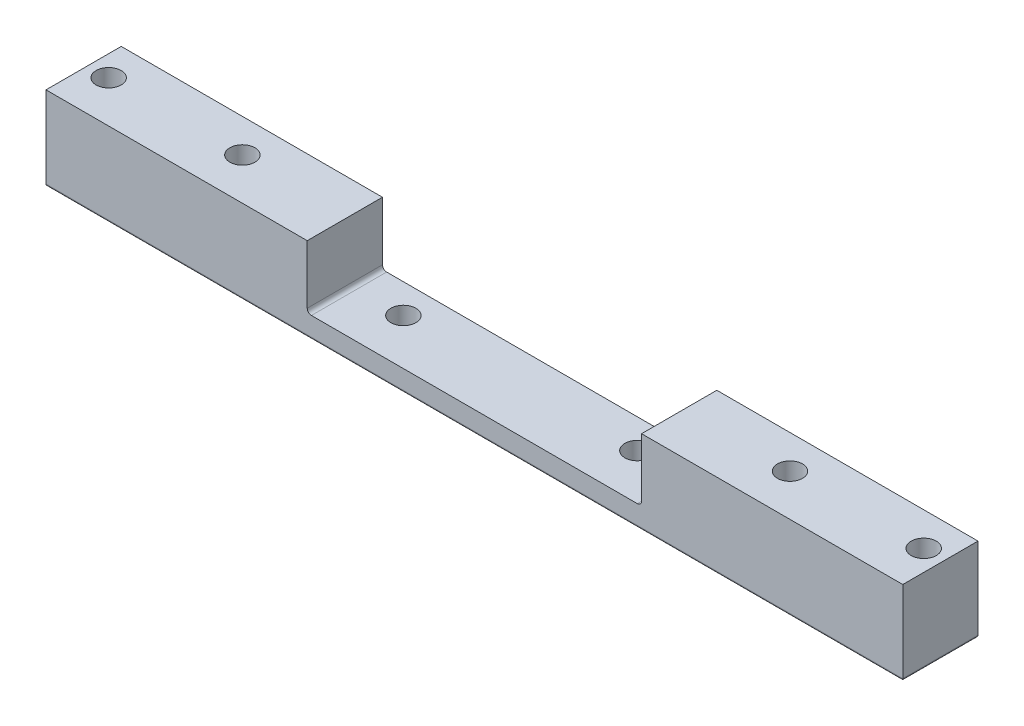
ISO-10303-21;
HEADER;
FILE_DESCRIPTION(('STEP AP214'),'2;1');
FILE_NAME('part.step','',(''),(''),'','','');
FILE_SCHEMA(('AUTOMOTIVE_DESIGN { 1 0 10303 214 1 1 1 1 }'));
ENDSEC;
DATA;
#1=APPLICATION_CONTEXT('core data for automotive mechanical design processes');
#2=APPLICATION_PROTOCOL_DEFINITION('international standard','automotive_design',2000,#1);
#3=PRODUCT_CONTEXT('',#1,'mechanical');
#4=PRODUCT('Part','Part','',(#3));
#5=PRODUCT_RELATED_PRODUCT_CATEGORY('part','',(#4));
#6=PRODUCT_DEFINITION_FORMATION('','',#4);
#7=PRODUCT_DEFINITION_CONTEXT('part definition',#1,'design');
#8=PRODUCT_DEFINITION('design','',#6,#7);
#9=PRODUCT_DEFINITION_SHAPE('','',#8);
#10=(LENGTH_UNIT() NAMED_UNIT(*) SI_UNIT(.MILLI.,.METRE.));
#11=(NAMED_UNIT(*) PLANE_ANGLE_UNIT() SI_UNIT($,.RADIAN.));
#12=(NAMED_UNIT(*) SI_UNIT($,.STERADIAN.) SOLID_ANGLE_UNIT());
#13=UNCERTAINTY_MEASURE_WITH_UNIT(LENGTH_MEASURE(1.E-05),#10,'distance_accuracy_value','');
#14=(GEOMETRIC_REPRESENTATION_CONTEXT(3) GLOBAL_UNCERTAINTY_ASSIGNED_CONTEXT((#13)) GLOBAL_UNIT_ASSIGNED_CONTEXT((#10,
#11,#12)) REPRESENTATION_CONTEXT('',''));
#15=CARTESIAN_POINT('',(0.,0.,0.));
#16=DIRECTION('',(0.,0.,1.));
#17=DIRECTION('',(1.,0.,0.));
#18=AXIS2_PLACEMENT_3D('',#15,#16,#17);
#19=CARTESIAN_POINT('',(62.5033,20.,0.));
#20=DIRECTION('',(1.,0.,0.));
#21=DIRECTION('',(0.,0.,-1.));
#22=AXIS2_PLACEMENT_3D('',#19,#20,#21);
#23=PLANE('',#22);
#24=DIRECTION('',(0.,-1.,0.));
#25=VECTOR('',#24,1.);
#26=CARTESIAN_POINT('',(62.5033,20.,18.));
#27=LINE('',#26,#25);
#28=CARTESIAN_POINT('',(62.5033,20.,18.));
#29=VERTEX_POINT('',#28);
#30=CARTESIAN_POINT('',(62.5033,6.,18.));
#31=VERTEX_POINT('',#30);
#32=EDGE_CURVE('E185',#29,#31,#27,.T.);
#33=ORIENTED_EDGE('',*,*,#32,.T.);
#34=DIRECTION('',(0.,0.,1.));
#35=VECTOR('',#34,1.);
#36=CARTESIAN_POINT('',(62.5033,6.,0.));
#37=LINE('',#36,#35);
#38=CARTESIAN_POINT('',(62.5033,6.,0.));
#39=VERTEX_POINT('',#38);
#40=EDGE_CURVE('E266',#31,#39,#37,.F.);
#41=ORIENTED_EDGE('',*,*,#40,.T.);
#42=DIRECTION('',(0.,-1.,0.));
#43=VECTOR('',#42,1.);
#44=CARTESIAN_POINT('',(62.5033,20.,0.));
#45=LINE('',#44,#43);
#46=CARTESIAN_POINT('',(62.5033,20.,0.));
#47=VERTEX_POINT('',#46);
#48=EDGE_CURVE('E194',#47,#39,#45,.T.);
#49=ORIENTED_EDGE('',*,*,#48,.F.);
#50=DIRECTION('',(0.,0.,1.));
#51=VECTOR('',#50,1.);
#52=CARTESIAN_POINT('',(62.5033,20.,0.));
#53=LINE('',#52,#51);
#54=EDGE_CURVE('E174',#47,#29,#53,.T.);
#55=ORIENTED_EDGE('',*,*,#54,.T.);
#56=EDGE_LOOP('',(#33,#41,#49,#55));
#57=FACE_BOUND('',#56,.T.);
#58=ADVANCED_FACE('F35',(#57),#23,.T.);
#59=CARTESIAN_POINT('',(0.,20.,0.));
#60=DIRECTION('',(0.,0.,-1.));
#61=DIRECTION('',(-1.,0.,0.));
#62=AXIS2_PLACEMENT_3D('',#59,#60,#61);
#63=PLANE('',#62);
#64=DIRECTION('',(0.,-1.,0.));
#65=VECTOR('',#64,1.);
#66=CARTESIAN_POINT('',(205.,20.,0.));
#67=LINE('',#66,#65);
#68=CARTESIAN_POINT('',(205.,20.,0.));
#69=VERTEX_POINT('',#68);
#70=CARTESIAN_POINT('',(205.,0.5,0.));
#71=VERTEX_POINT('',#70);
#72=EDGE_CURVE('E123',#69,#71,#67,.T.);
#73=ORIENTED_EDGE('',*,*,#72,.T.);
#74=DIRECTION('',(1.,0.,0.));
#75=VECTOR('',#74,1.);
#76=CARTESIAN_POINT('',(0.,0.5,0.));
#77=LINE('',#76,#75);
#78=CARTESIAN_POINT('',(0.,0.5,0.));
#79=VERTEX_POINT('',#78);
#80=EDGE_CURVE('E242',#71,#79,#77,.F.);
#81=ORIENTED_EDGE('',*,*,#80,.T.);
#82=DIRECTION('',(0.,-1.,0.));
#83=VECTOR('',#82,1.);
#84=CARTESIAN_POINT('',(0.,20.,0.));
#85=LINE('',#84,#83);
#86=CARTESIAN_POINT('',(0.,20.,0.));
#87=VERTEX_POINT('',#86);
#88=EDGE_CURVE('E191',#87,#79,#85,.T.);
#89=ORIENTED_EDGE('',*,*,#88,.F.);
#90=DIRECTION('',(1.,0.,0.));
#91=VECTOR('',#90,1.);
#92=CARTESIAN_POINT('',(0.,20.,0.));
#93=LINE('',#92,#91);
#94=EDGE_CURVE('E177',#87,#47,#93,.T.);
#95=ORIENTED_EDGE('',*,*,#94,.T.);
#96=ORIENTED_EDGE('',*,*,#48,.T.);
#97=CARTESIAN_POINT('',(63.5033,6.,0.));
#98=DIRECTION('',(0.,0.,-1.));
#99=DIRECTION('',(-1.,0.,0.));
#100=AXIS2_PLACEMENT_3D('',#97,#98,#99);
#101=CIRCLE('',#100,1.);
#102=CARTESIAN_POINT('',(63.5033,5.,0.));
#103=VERTEX_POINT('',#102);
#104=EDGE_CURVE('E272',#39,#103,#101,.F.);
#105=ORIENTED_EDGE('',*,*,#104,.T.);
#106=DIRECTION('',(1.,0.,0.));
#107=VECTOR('',#106,1.);
#108=CARTESIAN_POINT('',(0.,5.,0.));
#109=LINE('',#108,#107);
#110=CARTESIAN_POINT('',(141.5033,5.,0.));
#111=VERTEX_POINT('',#110);
#112=EDGE_CURVE('E163',#103,#111,#109,.T.);
#113=ORIENTED_EDGE('',*,*,#112,.T.);
#114=CARTESIAN_POINT('',(141.5033,6.,0.));
#115=DIRECTION('',(0.,0.,-1.));
#116=DIRECTION('',(-1.,0.,0.));
#117=AXIS2_PLACEMENT_3D('',#114,#115,#116);
#118=CIRCLE('',#117,1.);
#119=CARTESIAN_POINT('',(142.5033,6.,0.));
#120=VERTEX_POINT('',#119);
#121=EDGE_CURVE('E11',#111,#120,#118,.F.);
#122=ORIENTED_EDGE('',*,*,#121,.T.);
#123=DIRECTION('',(0.,-1.,0.));
#124=VECTOR('',#123,1.);
#125=CARTESIAN_POINT('',(142.5033,20.,0.));
#126=LINE('',#125,#124);
#127=CARTESIAN_POINT('',(142.5033,20.,0.));
#128=VERTEX_POINT('',#127);
#129=EDGE_CURVE('E133',#128,#120,#126,.T.);
#130=ORIENTED_EDGE('',*,*,#129,.F.);
#131=DIRECTION('',(1.,0.,0.));
#132=VECTOR('',#131,1.);
#133=CARTESIAN_POINT('',(0.,20.,0.));
#134=LINE('',#133,#132);
#135=EDGE_CURVE('E139',#128,#69,#134,.T.);
#136=ORIENTED_EDGE('',*,*,#135,.T.);
#137=EDGE_LOOP('',(#73,#81,#89,#95,#96,#105,#113,#122,#130,#136));
#138=FACE_BOUND('',#137,.T.);
#139=ADVANCED_FACE('F144',(#138),#63,.T.);
#140=CARTESIAN_POINT('',(0.,20.,0.));
#141=DIRECTION('',(1.,0.,0.));
#142=DIRECTION('',(0.,0.,-1.));
#143=AXIS2_PLACEMENT_3D('',#140,#141,#142);
#144=PLANE('',#143);
#145=ORIENTED_EDGE('',*,*,#88,.T.);
#146=DIRECTION('',(0.,0.,1.));
#147=VECTOR('',#146,1.);
#148=CARTESIAN_POINT('',(0.,0.5,0.));
#149=LINE('',#148,#147);
#150=CARTESIAN_POINT('',(0.,0.5,18.));
#151=VERTEX_POINT('',#150);
#152=EDGE_CURVE('E236',#79,#151,#149,.T.);
#153=ORIENTED_EDGE('',*,*,#152,.T.);
#154=DIRECTION('',(0.,-1.,0.));
#155=VECTOR('',#154,1.);
#156=CARTESIAN_POINT('',(0.,20.,18.));
#157=LINE('',#156,#155);
#158=CARTESIAN_POINT('',(0.,20.,18.));
#159=VERTEX_POINT('',#158);
#160=EDGE_CURVE('E188',#159,#151,#157,.T.);
#161=ORIENTED_EDGE('',*,*,#160,.F.);
#162=DIRECTION('',(0.,0.,1.));
#163=VECTOR('',#162,1.);
#164=CARTESIAN_POINT('',(0.,20.,0.));
#165=LINE('',#164,#163);
#166=EDGE_CURVE('E180',#87,#159,#165,.T.);
#167=ORIENTED_EDGE('',*,*,#166,.F.);
#168=EDGE_LOOP('',(#145,#153,#161,#167));
#169=FACE_BOUND('',#168,.T.);
#170=ADVANCED_FACE('F301',(#169),#144,.F.);
#171=CARTESIAN_POINT('',(4.99,20.,8.));
#172=DIRECTION('',(0.,-1.,0.));
#173=DIRECTION('',(0.,0.,-1.));
#174=AXIS2_PLACEMENT_3D('',#171,#172,#173);
#175=CYLINDRICAL_SURFACE('',#174,3.);
#176=CARTESIAN_POINT('',(4.99,0.5,8.));
#177=DIRECTION('',(0.,1.,0.));
#178=DIRECTION('',(0.,0.,1.));
#179=AXIS2_PLACEMENT_3D('',#176,#177,#178);
#180=CIRCLE('',#179,3.);
#181=CARTESIAN_POINT('',(4.99,0.5,11.));
#182=VERTEX_POINT('',#181);
#183=EDGE_CURVE('E244',#182,#182,#180,.F.);
#184=ORIENTED_EDGE('',*,*,#183,.T.);
#185=EDGE_LOOP('',(#184));
#186=FACE_BOUND('',#185,.T.);
#187=CARTESIAN_POINT('',(4.99,20.,8.));
#188=DIRECTION('',(0.,1.,0.));
#189=DIRECTION('',(0.,0.,1.));
#190=AXIS2_PLACEMENT_3D('',#187,#188,#189);
#191=CIRCLE('',#190,3.);
#192=CARTESIAN_POINT('',(4.99,20.,11.));
#193=VERTEX_POINT('',#192);
#194=EDGE_CURVE('E171',#193,#193,#191,.T.);
#195=ORIENTED_EDGE('',*,*,#194,.T.);
#196=EDGE_LOOP('',(#195));
#197=FACE_BOUND('',#196,.T.);
#198=ADVANCED_FACE('F305',(#186,#197),#175,.F.);
#199=CARTESIAN_POINT('',(36.99,20.,8.));
#200=DIRECTION('',(0.,-1.,0.));
#201=DIRECTION('',(0.,0.,-1.));
#202=AXIS2_PLACEMENT_3D('',#199,#200,#201);
#203=CYLINDRICAL_SURFACE('',#202,3.);
#204=CARTESIAN_POINT('',(36.99,0.5,8.));
#205=DIRECTION('',(0.,1.,0.));
#206=DIRECTION('',(0.,0.,1.));
#207=AXIS2_PLACEMENT_3D('',#204,#205,#206);
#208=CIRCLE('',#207,3.);
#209=CARTESIAN_POINT('',(36.99,0.5,11.));
#210=VERTEX_POINT('',#209);
#211=EDGE_CURVE('E247',#210,#210,#208,.F.);
#212=ORIENTED_EDGE('',*,*,#211,.T.);
#213=EDGE_LOOP('',(#212));
#214=FACE_BOUND('',#213,.T.);
#215=CARTESIAN_POINT('',(36.99,20.,8.));
#216=DIRECTION('',(0.,1.,0.));
#217=DIRECTION('',(0.,0.,1.));
#218=AXIS2_PLACEMENT_3D('',#215,#216,#217);
#219=CIRCLE('',#218,3.);
#220=CARTESIAN_POINT('',(36.99,20.,11.));
#221=VERTEX_POINT('',#220);
#222=EDGE_CURVE('E168',#221,#221,#219,.T.);
#223=ORIENTED_EDGE('',*,*,#222,.T.);
#224=EDGE_LOOP('',(#223));
#225=FACE_BOUND('',#224,.T.);
#226=ADVANCED_FACE('F308',(#214,#225),#203,.F.);
#227=CARTESIAN_POINT('',(0.,20.,18.));
#228=DIRECTION('',(0.,0.,-1.));
#229=DIRECTION('',(-1.,0.,0.));
#230=AXIS2_PLACEMENT_3D('',#227,#228,#229);
#231=PLANE('',#230);
#232=ORIENTED_EDGE('',*,*,#160,.T.);
#233=DIRECTION('',(1.,0.,0.));
#234=VECTOR('',#233,1.);
#235=CARTESIAN_POINT('',(0.,0.5,18.));
#236=LINE('',#235,#234);
#237=CARTESIAN_POINT('',(205.,0.5,18.));
#238=VERTEX_POINT('',#237);
#239=EDGE_CURVE('E239',#151,#238,#236,.T.);
#240=ORIENTED_EDGE('',*,*,#239,.T.);
#241=DIRECTION('',(0.,-1.,0.));
#242=VECTOR('',#241,1.);
#243=CARTESIAN_POINT('',(205.,20.,18.));
#244=LINE('',#243,#242);
#245=CARTESIAN_POINT('',(205.,20.,18.));
#246=VERTEX_POINT('',#245);
#247=EDGE_CURVE('E152',#246,#238,#244,.T.);
#248=ORIENTED_EDGE('',*,*,#247,.F.);
#249=DIRECTION('',(1.,0.,0.));
#250=VECTOR('',#249,1.);
#251=CARTESIAN_POINT('',(0.,20.,18.));
#252=LINE('',#251,#250);
#253=CARTESIAN_POINT('',(142.5033,20.,18.));
#254=VERTEX_POINT('',#253);
#255=EDGE_CURVE('E140',#254,#246,#252,.T.);
#256=ORIENTED_EDGE('',*,*,#255,.F.);
#257=DIRECTION('',(0.,-1.,0.));
#258=VECTOR('',#257,1.);
#259=CARTESIAN_POINT('',(142.5033,20.,18.));
#260=LINE('',#259,#258);
#261=CARTESIAN_POINT('',(142.5033,6.,18.));
#262=VERTEX_POINT('',#261);
#263=EDGE_CURVE('E154',#254,#262,#260,.T.);
#264=ORIENTED_EDGE('',*,*,#263,.T.);
#265=CARTESIAN_POINT('',(141.5033,6.,18.));
#266=DIRECTION('',(0.,0.,-1.));
#267=DIRECTION('',(-1.,0.,0.));
#268=AXIS2_PLACEMENT_3D('',#265,#266,#267);
#269=CIRCLE('',#268,1.);
#270=CARTESIAN_POINT('',(141.5033,5.,18.));
#271=VERTEX_POINT('',#270);
#272=EDGE_CURVE('E43',#262,#271,#269,.T.);
#273=ORIENTED_EDGE('',*,*,#272,.T.);
#274=DIRECTION('',(1.,0.,0.));
#275=VECTOR('',#274,1.);
#276=CARTESIAN_POINT('',(0.,5.,18.));
#277=LINE('',#276,#275);
#278=CARTESIAN_POINT('',(63.5033,5.,18.));
#279=VERTEX_POINT('',#278);
#280=EDGE_CURVE('E165',#279,#271,#277,.T.);
#281=ORIENTED_EDGE('',*,*,#280,.F.);
#282=CARTESIAN_POINT('',(63.5033,6.,18.));
#283=DIRECTION('',(0.,0.,-1.));
#284=DIRECTION('',(-1.,0.,0.));
#285=AXIS2_PLACEMENT_3D('',#282,#283,#284);
#286=CIRCLE('',#285,1.);
#287=EDGE_CURVE('E270',#279,#31,#286,.T.);
#288=ORIENTED_EDGE('',*,*,#287,.T.);
#289=ORIENTED_EDGE('',*,*,#32,.F.);
#290=DIRECTION('',(1.,0.,0.));
#291=VECTOR('',#290,1.);
#292=CARTESIAN_POINT('',(0.,20.,18.));
#293=LINE('',#292,#291);
#294=EDGE_CURVE('E183',#159,#29,#293,.T.);
#295=ORIENTED_EDGE('',*,*,#294,.F.);
#296=EDGE_LOOP('',(#232,#240,#248,#256,#264,#273,#281,#288,#289,#295));
#297=FACE_BOUND('',#296,.T.);
#298=ADVANCED_FACE('F275',(#297),#231,.F.);
#299=CARTESIAN_POINT('',(0.,20.,0.));
#300=DIRECTION('',(0.,1.,0.));
#301=DIRECTION('',(0.,0.,1.));
#302=AXIS2_PLACEMENT_3D('',#299,#300,#301);
#303=PLANE('',#302);
#304=ORIENTED_EDGE('',*,*,#222,.F.);
#305=EDGE_LOOP('',(#304));
#306=FACE_BOUND('',#305,.T.);
#307=ORIENTED_EDGE('',*,*,#194,.F.);
#308=EDGE_LOOP('',(#307));
#309=FACE_BOUND('',#308,.T.);
#310=ORIENTED_EDGE('',*,*,#54,.F.);
#311=ORIENTED_EDGE('',*,*,#94,.F.);
#312=ORIENTED_EDGE('',*,*,#166,.T.);
#313=ORIENTED_EDGE('',*,*,#294,.T.);
#314=EDGE_LOOP('',(#310,#311,#312,#313));
#315=FACE_BOUND('',#314,.T.);
#316=ADVANCED_FACE('F363',(#306,#309,#315),#303,.T.);
#317=CARTESIAN_POINT('',(0.,0.,0.));
#318=DIRECTION('',(0.,1.,0.));
#319=DIRECTION('',(0.,0.,1.));
#320=AXIS2_PLACEMENT_3D('',#317,#318,#319);
#321=PLANE('',#320);
#322=CARTESIAN_POINT('',(168.0133,0.,8.));
#323=DIRECTION('',(0.,1.,0.));
#324=DIRECTION('',(0.,0.,1.));
#325=AXIS2_PLACEMENT_3D('',#322,#323,#324);
#326=CIRCLE('',#325,3.49999999999999);
#327=CARTESIAN_POINT('',(168.0133,0.,11.5));
#328=VERTEX_POINT('',#327);
#329=EDGE_CURVE('E221',#328,#328,#326,.T.);
#330=ORIENTED_EDGE('',*,*,#329,.T.);
#331=EDGE_LOOP('',(#330));
#332=FACE_BOUND('',#331,.T.);
#333=CARTESIAN_POINT('',(200.0133,0.,8.));
#334=DIRECTION('',(0.,1.,0.));
#335=DIRECTION('',(0.,0.,1.));
#336=AXIS2_PLACEMENT_3D('',#333,#334,#335);
#337=CIRCLE('',#336,3.49999999999999);
#338=CARTESIAN_POINT('',(200.0133,0.,11.5));
#339=VERTEX_POINT('',#338);
#340=EDGE_CURVE('E218',#339,#339,#337,.T.);
#341=ORIENTED_EDGE('',*,*,#340,.T.);
#342=EDGE_LOOP('',(#341));
#343=FACE_BOUND('',#342,.T.);
#344=CARTESIAN_POINT('',(74.5033,0.,7.));
#345=DIRECTION('',(0.,1.,0.));
#346=DIRECTION('',(0.,0.,1.));
#347=AXIS2_PLACEMENT_3D('',#344,#345,#346);
#348=CIRCLE('',#347,3.50000000000001);
#349=CARTESIAN_POINT('',(74.5033,0.,10.5));
#350=VERTEX_POINT('',#349);
#351=EDGE_CURVE('E215',#350,#350,#348,.T.);
#352=ORIENTED_EDGE('',*,*,#351,.T.);
#353=EDGE_LOOP('',(#352));
#354=FACE_BOUND('',#353,.T.);
#355=CARTESIAN_POINT('',(130.5033,0.,7.));
#356=DIRECTION('',(0.,1.,0.));
#357=DIRECTION('',(0.,0.,1.));
#358=AXIS2_PLACEMENT_3D('',#355,#356,#357);
#359=CIRCLE('',#358,3.49999999999999);
#360=CARTESIAN_POINT('',(130.5033,0.,10.5));
#361=VERTEX_POINT('',#360);
#362=EDGE_CURVE('E212',#361,#361,#359,.T.);
#363=ORIENTED_EDGE('',*,*,#362,.T.);
#364=EDGE_LOOP('',(#363));
#365=FACE_BOUND('',#364,.T.);
#366=DIRECTION('',(1.,0.,0.));
#367=VECTOR('',#366,1.);
#368=CARTESIAN_POINT('',(0.,0.,17.5));
#369=LINE('',#368,#367);
#370=CARTESIAN_POINT('',(204.5,0.,17.5));
#371=VERTEX_POINT('',#370);
#372=CARTESIAN_POINT('',(0.500000000000013,0.,17.5));
#373=VERTEX_POINT('',#372);
#374=EDGE_CURVE('E207',#371,#373,#369,.F.);
#375=ORIENTED_EDGE('',*,*,#374,.T.);
#376=DIRECTION('',(0.,0.,1.));
#377=VECTOR('',#376,1.);
#378=CARTESIAN_POINT('',(0.5,0.,0.));
#379=LINE('',#378,#377);
#380=CARTESIAN_POINT('',(0.5,0.,0.5));
#381=VERTEX_POINT('',#380);
#382=EDGE_CURVE('E209',#373,#381,#379,.F.);
#383=ORIENTED_EDGE('',*,*,#382,.T.);
#384=DIRECTION('',(1.,0.,0.));
#385=VECTOR('',#384,1.);
#386=CARTESIAN_POINT('',(205.,0.,0.5));
#387=LINE('',#386,#385);
#388=CARTESIAN_POINT('',(204.5,0.,0.5));
#389=VERTEX_POINT('',#388);
#390=EDGE_CURVE('E203',#381,#389,#387,.T.);
#391=ORIENTED_EDGE('',*,*,#390,.T.);
#392=DIRECTION('',(0.,0.,1.));
#393=VECTOR('',#392,1.);
#394=CARTESIAN_POINT('',(204.5,0.,18.));
#395=LINE('',#394,#393);
#396=EDGE_CURVE('E205',#389,#371,#395,.T.);
#397=ORIENTED_EDGE('',*,*,#396,.T.);
#398=EDGE_LOOP('',(#375,#383,#391,#397));
#399=FACE_BOUND('',#398,.T.);
#400=CARTESIAN_POINT('',(4.99,0.,8.));
#401=DIRECTION('',(0.,1.,0.));
#402=DIRECTION('',(0.,0.,1.));
#403=AXIS2_PLACEMENT_3D('',#400,#401,#402);
#404=CIRCLE('',#403,3.5);
#405=CARTESIAN_POINT('',(4.99,0.,11.5));
#406=VERTEX_POINT('',#405);
#407=EDGE_CURVE('E200',#406,#406,#404,.T.);
#408=ORIENTED_EDGE('',*,*,#407,.T.);
#409=EDGE_LOOP('',(#408));
#410=FACE_BOUND('',#409,.T.);
#411=CARTESIAN_POINT('',(36.99,0.,8.));
#412=DIRECTION('',(0.,1.,0.));
#413=DIRECTION('',(0.,0.,1.));
#414=AXIS2_PLACEMENT_3D('',#411,#412,#413);
#415=CIRCLE('',#414,3.5);
#416=CARTESIAN_POINT('',(36.99,0.,11.5));
#417=VERTEX_POINT('',#416);
#418=EDGE_CURVE('E197',#417,#417,#415,.T.);
#419=ORIENTED_EDGE('',*,*,#418,.T.);
#420=EDGE_LOOP('',(#419));
#421=FACE_BOUND('',#420,.T.);
#422=ADVANCED_FACE('F379',(#332,#343,#354,#365,#399,#410,#421),#321,.F.);
#423=CARTESIAN_POINT('',(74.5033,5.,7.));
#424=DIRECTION('',(0.,-1.,0.));
#425=DIRECTION('',(0.,0.,-1.));
#426=AXIS2_PLACEMENT_3D('',#423,#424,#425);
#427=CYLINDRICAL_SURFACE('',#426,3.00000000000001);
#428=CARTESIAN_POINT('',(74.5033,0.5,7.));
#429=DIRECTION('',(0.,1.,0.));
#430=DIRECTION('',(0.,0.,1.));
#431=AXIS2_PLACEMENT_3D('',#428,#429,#430);
#432=CIRCLE('',#431,3.00000000000001);
#433=CARTESIAN_POINT('',(74.5033,0.5,10.));
#434=VERTEX_POINT('',#433);
#435=EDGE_CURVE('E230',#434,#434,#432,.F.);
#436=ORIENTED_EDGE('',*,*,#435,.T.);
#437=EDGE_LOOP('',(#436));
#438=FACE_BOUND('',#437,.T.);
#439=CARTESIAN_POINT('',(74.5033,5.,7.));
#440=DIRECTION('',(0.,1.,0.));
#441=DIRECTION('',(0.,0.,1.));
#442=AXIS2_PLACEMENT_3D('',#439,#440,#441);
#443=CIRCLE('',#442,3.00000000000001);
#444=CARTESIAN_POINT('',(74.5033,5.,10.));
#445=VERTEX_POINT('',#444);
#446=EDGE_CURVE('E160',#445,#445,#443,.T.);
#447=ORIENTED_EDGE('',*,*,#446,.T.);
#448=EDGE_LOOP('',(#447));
#449=FACE_BOUND('',#448,.T.);
#450=ADVANCED_FACE('F382',(#438,#449),#427,.F.);
#451=CARTESIAN_POINT('',(130.5033,5.,7.));
#452=DIRECTION('',(0.,-1.,0.));
#453=DIRECTION('',(0.,0.,-1.));
#454=AXIS2_PLACEMENT_3D('',#451,#452,#453);
#455=CYLINDRICAL_SURFACE('',#454,2.99999999999999);
#456=CARTESIAN_POINT('',(130.5033,0.5,7.));
#457=DIRECTION('',(0.,1.,0.));
#458=DIRECTION('',(0.,0.,1.));
#459=AXIS2_PLACEMENT_3D('',#456,#457,#458);
#460=CIRCLE('',#459,2.99999999999999);
#461=CARTESIAN_POINT('',(130.5033,0.5,9.99999999999999));
#462=VERTEX_POINT('',#461);
#463=EDGE_CURVE('E233',#462,#462,#460,.F.);
#464=ORIENTED_EDGE('',*,*,#463,.T.);
#465=EDGE_LOOP('',(#464));
#466=FACE_BOUND('',#465,.T.);
#467=CARTESIAN_POINT('',(130.5033,5.,7.));
#468=DIRECTION('',(0.,1.,0.));
#469=DIRECTION('',(0.,0.,1.));
#470=AXIS2_PLACEMENT_3D('',#467,#468,#469);
#471=CIRCLE('',#470,2.99999999999999);
#472=CARTESIAN_POINT('',(130.5033,5.,9.99999999999999));
#473=VERTEX_POINT('',#472);
#474=EDGE_CURVE('E132',#473,#473,#471,.T.);
#475=ORIENTED_EDGE('',*,*,#474,.T.);
#476=EDGE_LOOP('',(#475));
#477=FACE_BOUND('',#476,.T.);
#478=ADVANCED_FACE('F291',(#466,#477),#455,.F.);
#479=CARTESIAN_POINT('',(0.,5.,0.));
#480=DIRECTION('',(0.,1.,0.));
#481=DIRECTION('',(0.,0.,1.));
#482=AXIS2_PLACEMENT_3D('',#479,#480,#481);
#483=PLANE('',#482);
#484=ORIENTED_EDGE('',*,*,#474,.F.);
#485=EDGE_LOOP('',(#484));
#486=FACE_BOUND('',#485,.T.);
#487=ORIENTED_EDGE('',*,*,#446,.F.);
#488=EDGE_LOOP('',(#487));
#489=FACE_BOUND('',#488,.T.);
#490=ORIENTED_EDGE('',*,*,#112,.F.);
#491=DIRECTION('',(0.,0.,1.));
#492=VECTOR('',#491,1.);
#493=CARTESIAN_POINT('',(63.5033,5.,18.));
#494=LINE('',#493,#492);
#495=EDGE_CURVE('E263',#103,#279,#494,.T.);
#496=ORIENTED_EDGE('',*,*,#495,.T.);
#497=ORIENTED_EDGE('',*,*,#280,.T.);
#498=DIRECTION('',(0.,0.,1.));
#499=VECTOR('',#498,1.);
#500=CARTESIAN_POINT('',(141.5033,5.,0.));
#501=LINE('',#500,#499);
#502=EDGE_CURVE('E250',#271,#111,#501,.F.);
#503=ORIENTED_EDGE('',*,*,#502,.T.);
#504=EDGE_LOOP('',(#490,#496,#497,#503));
#505=FACE_BOUND('',#504,.T.);
#506=ADVANCED_FACE('F279',(#486,#489,#505),#483,.T.);
#507=CARTESIAN_POINT('',(142.5033,20.,0.));
#508=DIRECTION('',(1.,0.,0.));
#509=DIRECTION('',(0.,0.,-1.));
#510=AXIS2_PLACEMENT_3D('',#507,#508,#509);
#511=PLANE('',#510);
#512=ORIENTED_EDGE('',*,*,#129,.T.);
#513=DIRECTION('',(0.,0.,1.));
#514=VECTOR('',#513,1.);
#515=CARTESIAN_POINT('',(142.5033,6.,0.));
#516=LINE('',#515,#514);
#517=EDGE_CURVE('E268',#120,#262,#516,.T.);
#518=ORIENTED_EDGE('',*,*,#517,.T.);
#519=ORIENTED_EDGE('',*,*,#263,.F.);
#520=DIRECTION('',(0.,0.,1.));
#521=VECTOR('',#520,1.);
#522=CARTESIAN_POINT('',(142.5033,20.,0.));
#523=LINE('',#522,#521);
#524=EDGE_CURVE('E146',#128,#254,#523,.T.);
#525=ORIENTED_EDGE('',*,*,#524,.F.);
#526=EDGE_LOOP('',(#512,#518,#519,#525));
#527=FACE_BOUND('',#526,.T.);
#528=ADVANCED_FACE('F282',(#527),#511,.F.);
#529=CARTESIAN_POINT('',(205.,20.,0.));
#530=DIRECTION('',(1.,0.,0.));
#531=DIRECTION('',(0.,0.,-1.));
#532=AXIS2_PLACEMENT_3D('',#529,#530,#531);
#533=PLANE('',#532);
#534=ORIENTED_EDGE('',*,*,#247,.T.);
#535=DIRECTION('',(0.,0.,1.));
#536=VECTOR('',#535,1.);
#537=CARTESIAN_POINT('',(205.,0.5,0.));
#538=LINE('',#537,#536);
#539=EDGE_CURVE('E129',#238,#71,#538,.F.);
#540=ORIENTED_EDGE('',*,*,#539,.T.);
#541=ORIENTED_EDGE('',*,*,#72,.F.);
#542=DIRECTION('',(0.,0.,1.));
#543=VECTOR('',#542,1.);
#544=CARTESIAN_POINT('',(205.,20.,0.));
#545=LINE('',#544,#543);
#546=EDGE_CURVE('E127',#69,#246,#545,.T.);
#547=ORIENTED_EDGE('',*,*,#546,.T.);
#548=EDGE_LOOP('',(#534,#540,#541,#547));
#549=FACE_BOUND('',#548,.T.);
#550=ADVANCED_FACE('F126',(#549),#533,.T.);
#551=CARTESIAN_POINT('',(168.0133,20.,8.));
#552=DIRECTION('',(0.,-1.,0.));
#553=DIRECTION('',(0.,0.,-1.));
#554=AXIS2_PLACEMENT_3D('',#551,#552,#553);
#555=CYLINDRICAL_SURFACE('',#554,2.99999999999999);
#556=CARTESIAN_POINT('',(168.0133,0.5,8.));
#557=DIRECTION('',(0.,1.,0.));
#558=DIRECTION('',(0.,0.,1.));
#559=AXIS2_PLACEMENT_3D('',#556,#557,#558);
#560=CIRCLE('',#559,2.99999999999999);
#561=CARTESIAN_POINT('',(168.0133,0.5,11.));
#562=VERTEX_POINT('',#561);
#563=EDGE_CURVE('E224',#562,#562,#560,.F.);
#564=ORIENTED_EDGE('',*,*,#563,.T.);
#565=EDGE_LOOP('',(#564));
#566=FACE_BOUND('',#565,.T.);
#567=CARTESIAN_POINT('',(168.0133,20.,8.));
#568=DIRECTION('',(0.,1.,0.));
#569=DIRECTION('',(0.,0.,1.));
#570=AXIS2_PLACEMENT_3D('',#567,#568,#569);
#571=CIRCLE('',#570,2.99999999999999);
#572=CARTESIAN_POINT('',(168.0133,20.,11.));
#573=VERTEX_POINT('',#572);
#574=EDGE_CURVE('E142',#573,#573,#571,.T.);
#575=ORIENTED_EDGE('',*,*,#574,.T.);
#576=EDGE_LOOP('',(#575));
#577=FACE_BOUND('',#576,.T.);
#578=ADVANCED_FACE('F289',(#566,#577),#555,.F.);
#579=CARTESIAN_POINT('',(200.0133,20.,8.));
#580=DIRECTION('',(0.,-1.,0.));
#581=DIRECTION('',(0.,0.,-1.));
#582=AXIS2_PLACEMENT_3D('',#579,#580,#581);
#583=CYLINDRICAL_SURFACE('',#582,2.99999999999999);
#584=CARTESIAN_POINT('',(200.0133,0.5,8.));
#585=DIRECTION('',(0.,1.,0.));
#586=DIRECTION('',(0.,0.,1.));
#587=AXIS2_PLACEMENT_3D('',#584,#585,#586);
#588=CIRCLE('',#587,2.99999999999999);
#589=CARTESIAN_POINT('',(200.0133,0.5,11.));
#590=VERTEX_POINT('',#589);
#591=EDGE_CURVE('E227',#590,#590,#588,.F.);
#592=ORIENTED_EDGE('',*,*,#591,.T.);
#593=EDGE_LOOP('',(#592));
#594=FACE_BOUND('',#593,.T.);
#595=CARTESIAN_POINT('',(200.0133,20.,8.));
#596=DIRECTION('',(0.,1.,0.));
#597=DIRECTION('',(0.,0.,1.));
#598=AXIS2_PLACEMENT_3D('',#595,#596,#597);
#599=CIRCLE('',#598,2.99999999999999);
#600=CARTESIAN_POINT('',(200.0133,20.,11.));
#601=VERTEX_POINT('',#600);
#602=EDGE_CURVE('E261',#601,#601,#599,.T.);
#603=ORIENTED_EDGE('',*,*,#602,.T.);
#604=EDGE_LOOP('',(#603));
#605=FACE_BOUND('',#604,.T.);
#606=ADVANCED_FACE('F434',(#594,#605),#583,.F.);
#607=CARTESIAN_POINT('',(0.,20.,0.));
#608=DIRECTION('',(0.,1.,0.));
#609=DIRECTION('',(0.,0.,1.));
#610=AXIS2_PLACEMENT_3D('',#607,#608,#609);
#611=PLANE('',#610);
#612=ORIENTED_EDGE('',*,*,#602,.F.);
#613=EDGE_LOOP('',(#612));
#614=FACE_BOUND('',#613,.T.);
#615=ORIENTED_EDGE('',*,*,#574,.F.);
#616=EDGE_LOOP('',(#615));
#617=FACE_BOUND('',#616,.T.);
#618=ORIENTED_EDGE('',*,*,#546,.F.);
#619=ORIENTED_EDGE('',*,*,#135,.F.);
#620=ORIENTED_EDGE('',*,*,#524,.T.);
#621=ORIENTED_EDGE('',*,*,#255,.T.);
#622=EDGE_LOOP('',(#618,#619,#620,#621));
#623=FACE_BOUND('',#622,.T.);
#624=ADVANCED_FACE('F137',(#614,#617,#623),#611,.T.);
#625=CARTESIAN_POINT('',(168.0133,0.5,8.));
#626=DIRECTION('',(0.,1.,0.));
#627=DIRECTION('',(0.,0.,1.));
#628=AXIS2_PLACEMENT_3D('',#625,#626,#627);
#629=TOROIDAL_SURFACE('',#628,3.49999999999999,0.5);
#630=ORIENTED_EDGE('',*,*,#563,.F.);
#631=EDGE_LOOP('',(#630));
#632=FACE_BOUND('',#631,.T.);
#633=ORIENTED_EDGE('',*,*,#329,.F.);
#634=EDGE_LOOP('',(#633));
#635=FACE_BOUND('',#634,.T.);
#636=ADVANCED_FACE('F313',(#632,#635),#629,.T.);
#637=CARTESIAN_POINT('',(200.0133,0.5,8.));
#638=DIRECTION('',(0.,1.,0.));
#639=DIRECTION('',(0.,0.,1.));
#640=AXIS2_PLACEMENT_3D('',#637,#638,#639);
#641=TOROIDAL_SURFACE('',#640,3.49999999999999,0.5);
#642=ORIENTED_EDGE('',*,*,#591,.F.);
#643=EDGE_LOOP('',(#642));
#644=FACE_BOUND('',#643,.T.);
#645=ORIENTED_EDGE('',*,*,#340,.F.);
#646=EDGE_LOOP('',(#645));
#647=FACE_BOUND('',#646,.T.);
#648=ADVANCED_FACE('F316',(#644,#647),#641,.T.);
#649=CARTESIAN_POINT('',(74.5033,0.5,7.));
#650=DIRECTION('',(0.,1.,0.));
#651=DIRECTION('',(0.,0.,1.));
#652=AXIS2_PLACEMENT_3D('',#649,#650,#651);
#653=TOROIDAL_SURFACE('',#652,3.50000000000001,0.5);
#654=ORIENTED_EDGE('',*,*,#435,.F.);
#655=EDGE_LOOP('',(#654));
#656=FACE_BOUND('',#655,.T.);
#657=ORIENTED_EDGE('',*,*,#351,.F.);
#658=EDGE_LOOP('',(#657));
#659=FACE_BOUND('',#658,.T.);
#660=ADVANCED_FACE('F320',(#656,#659),#653,.T.);
#661=CARTESIAN_POINT('',(130.5033,0.5,7.));
#662=DIRECTION('',(0.,1.,0.));
#663=DIRECTION('',(0.,0.,1.));
#664=AXIS2_PLACEMENT_3D('',#661,#662,#663);
#665=TOROIDAL_SURFACE('',#664,3.49999999999999,0.5);
#666=ORIENTED_EDGE('',*,*,#463,.F.);
#667=EDGE_LOOP('',(#666));
#668=FACE_BOUND('',#667,.T.);
#669=ORIENTED_EDGE('',*,*,#362,.F.);
#670=EDGE_LOOP('',(#669));
#671=FACE_BOUND('',#670,.T.);
#672=ADVANCED_FACE('F324',(#668,#671),#665,.T.);
#673=CARTESIAN_POINT('',(204.5,0.5,0.));
#674=DIRECTION('',(0.,0.,-1.));
#675=DIRECTION('',(-1.,0.,0.));
#676=AXIS2_PLACEMENT_3D('',#673,#674,#675);
#677=CYLINDRICAL_SURFACE('',#676,0.5);
#678=CARTESIAN_POINT('',(204.5,0.5,17.5));
#679=DIRECTION('',(0.707106781186547,0.,-0.707106781186547));
#680=DIRECTION('',(-0.707106781186547,0.,-0.707106781186547));
#681=AXIS2_PLACEMENT_3D('',#678,#679,#680);
#682=ELLIPSE('',#681,0.707106781186547,0.5);
#683=EDGE_CURVE('E255',#371,#238,#682,.F.);
#684=ORIENTED_EDGE('',*,*,#683,.F.);
#685=ORIENTED_EDGE('',*,*,#396,.F.);
#686=CARTESIAN_POINT('',(204.5,0.5,0.5));
#687=DIRECTION('',(-0.707106781186547,0.,-0.707106781186547));
#688=DIRECTION('',(-0.707106781186547,0.,0.707106781186547));
#689=AXIS2_PLACEMENT_3D('',#686,#687,#688);
#690=ELLIPSE('',#689,0.707106781186547,0.5);
#691=EDGE_CURVE('E258',#71,#389,#690,.T.);
#692=ORIENTED_EDGE('',*,*,#691,.F.);
#693=ORIENTED_EDGE('',*,*,#539,.F.);
#694=EDGE_LOOP('',(#684,#685,#692,#693));
#695=FACE_BOUND('',#694,.T.);
#696=ADVANCED_FACE('F328',(#695),#677,.T.);
#697=CARTESIAN_POINT('',(0.,0.5,0.5));
#698=DIRECTION('',(-1.,0.,0.));
#699=DIRECTION('',(0.,0.,1.));
#700=AXIS2_PLACEMENT_3D('',#697,#698,#699);
#701=CYLINDRICAL_SURFACE('',#700,0.5);
#702=ORIENTED_EDGE('',*,*,#691,.T.);
#703=ORIENTED_EDGE('',*,*,#390,.F.);
#704=CARTESIAN_POINT('',(0.5,0.5,0.5));
#705=DIRECTION('',(-0.707106781186547,0.,0.707106781186548));
#706=DIRECTION('',(-0.707106781186548,0.,-0.707106781186547));
#707=AXIS2_PLACEMENT_3D('',#704,#705,#706);
#708=ELLIPSE('',#707,0.707106781186548,0.5);
#709=EDGE_CURVE('E253',#79,#381,#708,.T.);
#710=ORIENTED_EDGE('',*,*,#709,.F.);
#711=ORIENTED_EDGE('',*,*,#80,.F.);
#712=EDGE_LOOP('',(#702,#703,#710,#711));
#713=FACE_BOUND('',#712,.T.);
#714=ADVANCED_FACE('F338',(#713),#701,.T.);
#715=CARTESIAN_POINT('',(0.,0.5,17.5));
#716=DIRECTION('',(1.,0.,0.));
#717=DIRECTION('',(0.,0.,-1.));
#718=AXIS2_PLACEMENT_3D('',#715,#716,#717);
#719=CYLINDRICAL_SURFACE('',#718,0.5);
#720=ORIENTED_EDGE('',*,*,#683,.T.);
#721=ORIENTED_EDGE('',*,*,#239,.F.);
#722=CARTESIAN_POINT('',(0.500000000000013,0.5,17.5));
#723=DIRECTION('',(0.707106781186548,0.,0.707106781186547));
#724=DIRECTION('',(0.707106781186547,0.,-0.707106781186548));
#725=AXIS2_PLACEMENT_3D('',#722,#723,#724);
#726=ELLIPSE('',#725,0.707106781186547,0.5);
#727=EDGE_CURVE('E251',#373,#151,#726,.F.);
#728=ORIENTED_EDGE('',*,*,#727,.F.);
#729=ORIENTED_EDGE('',*,*,#374,.F.);
#730=EDGE_LOOP('',(#720,#721,#728,#729));
#731=FACE_BOUND('',#730,.T.);
#732=ADVANCED_FACE('F334',(#731),#719,.T.);
#733=CARTESIAN_POINT('',(0.5,0.5,0.));
#734=DIRECTION('',(0.,0.,1.));
#735=DIRECTION('',(1.,0.,0.));
#736=AXIS2_PLACEMENT_3D('',#733,#734,#735);
#737=CYLINDRICAL_SURFACE('',#736,0.5);
#738=ORIENTED_EDGE('',*,*,#709,.T.);
#739=ORIENTED_EDGE('',*,*,#382,.F.);
#740=ORIENTED_EDGE('',*,*,#727,.T.);
#741=ORIENTED_EDGE('',*,*,#152,.F.);
#742=EDGE_LOOP('',(#738,#739,#740,#741));
#743=FACE_BOUND('',#742,.T.);
#744=ADVANCED_FACE('F330',(#743),#737,.T.);
#745=CARTESIAN_POINT('',(4.99,0.5,8.));
#746=DIRECTION('',(0.,1.,0.));
#747=DIRECTION('',(0.,0.,1.));
#748=AXIS2_PLACEMENT_3D('',#745,#746,#747);
#749=TOROIDAL_SURFACE('',#748,3.5,0.5);
#750=ORIENTED_EDGE('',*,*,#183,.F.);
#751=EDGE_LOOP('',(#750));
#752=FACE_BOUND('',#751,.T.);
#753=ORIENTED_EDGE('',*,*,#407,.F.);
#754=EDGE_LOOP('',(#753));
#755=FACE_BOUND('',#754,.T.);
#756=ADVANCED_FACE('F333',(#752,#755),#749,.T.);
#757=CARTESIAN_POINT('',(36.99,0.5,8.));
#758=DIRECTION('',(0.,1.,0.));
#759=DIRECTION('',(0.,0.,1.));
#760=AXIS2_PLACEMENT_3D('',#757,#758,#759);
#761=TOROIDAL_SURFACE('',#760,3.5,0.5);
#762=ORIENTED_EDGE('',*,*,#211,.F.);
#763=EDGE_LOOP('',(#762));
#764=FACE_BOUND('',#763,.T.);
#765=ORIENTED_EDGE('',*,*,#418,.F.);
#766=EDGE_LOOP('',(#765));
#767=FACE_BOUND('',#766,.T.);
#768=ADVANCED_FACE('F348',(#764,#767),#761,.T.);
#769=CARTESIAN_POINT('',(63.5033,6.,0.));
#770=DIRECTION('',(0.,0.,-1.));
#771=DIRECTION('',(-1.,0.,0.));
#772=AXIS2_PLACEMENT_3D('',#769,#770,#771);
#773=CYLINDRICAL_SURFACE('',#772,1.);
#774=ORIENTED_EDGE('',*,*,#104,.F.);
#775=ORIENTED_EDGE('',*,*,#40,.F.);
#776=ORIENTED_EDGE('',*,*,#287,.F.);
#777=ORIENTED_EDGE('',*,*,#495,.F.);
#778=EDGE_LOOP('',(#774,#775,#776,#777));
#779=FACE_BOUND('',#778,.T.);
#780=ADVANCED_FACE('F351',(#779),#773,.F.);
#781=CARTESIAN_POINT('',(141.5033,6.,0.));
#782=DIRECTION('',(0.,0.,1.));
#783=DIRECTION('',(1.,0.,0.));
#784=AXIS2_PLACEMENT_3D('',#781,#782,#783);
#785=CYLINDRICAL_SURFACE('',#784,1.);
#786=ORIENTED_EDGE('',*,*,#121,.F.);
#787=ORIENTED_EDGE('',*,*,#502,.F.);
#788=ORIENTED_EDGE('',*,*,#272,.F.);
#789=ORIENTED_EDGE('',*,*,#517,.F.);
#790=EDGE_LOOP('',(#786,#787,#788,#789));
#791=FACE_BOUND('',#790,.T.);
#792=ADVANCED_FACE('F37',(#791),#785,.F.);
#793=CLOSED_SHELL('',(#58,#139,#170,#198,#226,#298,#316,#422,#450,#478,#506,#528,#550,#578,#606,
#624,#636,#648,#660,#672,#696,#714,#732,#744,#756,#768,#780,#792));
#794=MANIFOLD_SOLID_BREP('B2',#793);
#795=ADVANCED_BREP_SHAPE_REPRESENTATION('',(#18,#794),#14);
#796=SHAPE_DEFINITION_REPRESENTATION(#9,#795);
ENDSEC;
END-ISO-10303-21;
